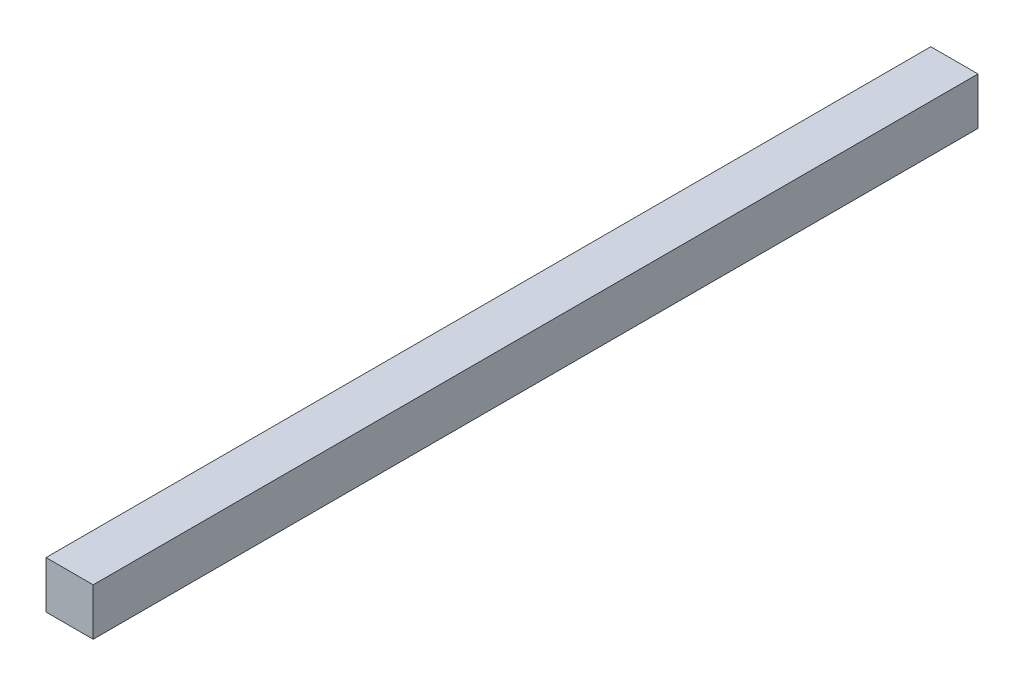
ISO-10303-21;
HEADER;
FILE_DESCRIPTION(('STEP AP214'),'2;1');
FILE_NAME('part.step','',(''),(''),'','','');
FILE_SCHEMA(('AUTOMOTIVE_DESIGN { 1 0 10303 214 1 1 1 1 }'));
ENDSEC;
DATA;
#1=APPLICATION_CONTEXT('core data for automotive mechanical design processes');
#2=APPLICATION_PROTOCOL_DEFINITION('international standard','automotive_design',2000,#1);
#3=PRODUCT_CONTEXT('',#1,'mechanical');
#4=PRODUCT('Part','Part','',(#3));
#5=PRODUCT_RELATED_PRODUCT_CATEGORY('part','',(#4));
#6=PRODUCT_DEFINITION_FORMATION('','',#4);
#7=PRODUCT_DEFINITION_CONTEXT('part definition',#1,'design');
#8=PRODUCT_DEFINITION('design','',#6,#7);
#9=PRODUCT_DEFINITION_SHAPE('','',#8);
#10=(LENGTH_UNIT() NAMED_UNIT(*) SI_UNIT(.MILLI.,.METRE.));
#11=(NAMED_UNIT(*) PLANE_ANGLE_UNIT() SI_UNIT($,.RADIAN.));
#12=(NAMED_UNIT(*) SI_UNIT($,.STERADIAN.) SOLID_ANGLE_UNIT());
#13=UNCERTAINTY_MEASURE_WITH_UNIT(LENGTH_MEASURE(1.E-05),#10,'distance_accuracy_value','');
#14=(GEOMETRIC_REPRESENTATION_CONTEXT(3) GLOBAL_UNCERTAINTY_ASSIGNED_CONTEXT((#13)) GLOBAL_UNIT_ASSIGNED_CONTEXT((#10,
#11,#12)) REPRESENTATION_CONTEXT('',''));
#15=CARTESIAN_POINT('',(0.,0.,0.));
#16=DIRECTION('',(0.,0.,1.));
#17=DIRECTION('',(1.,0.,0.));
#18=AXIS2_PLACEMENT_3D('',#15,#16,#17);
#19=CARTESIAN_POINT('',(0.,0.,300.));
#20=DIRECTION('',(1.,0.,0.));
#21=DIRECTION('',(0.,0.,-1.));
#22=AXIS2_PLACEMENT_3D('',#19,#20,#21);
#23=PLANE('',#22);
#24=DIRECTION('',(0.,-1.,0.));
#25=VECTOR('',#24,1.);
#26=CARTESIAN_POINT('',(0.,0.,0.));
#27=LINE('',#26,#25);
#28=CARTESIAN_POINT('',(0.,16.,0.));
#29=VERTEX_POINT('',#28);
#30=CARTESIAN_POINT('',(0.,0.,0.));
#31=VERTEX_POINT('',#30);
#32=EDGE_CURVE('E96',#29,#31,#27,.T.);
#33=ORIENTED_EDGE('',*,*,#32,.T.);
#34=DIRECTION('',(0.,0.,-1.));
#35=VECTOR('',#34,1.);
#36=CARTESIAN_POINT('',(0.,0.,300.));
#37=LINE('',#36,#35);
#38=CARTESIAN_POINT('',(0.,0.,300.));
#39=VERTEX_POINT('',#38);
#40=EDGE_CURVE('E11',#39,#31,#37,.T.);
#41=ORIENTED_EDGE('',*,*,#40,.F.);
#42=DIRECTION('',(0.,-1.,0.));
#43=VECTOR('',#42,1.);
#44=CARTESIAN_POINT('',(0.,0.,300.));
#45=LINE('',#44,#43);
#46=CARTESIAN_POINT('',(0.,16.,300.));
#47=VERTEX_POINT('',#46);
#48=EDGE_CURVE('E84',#47,#39,#45,.T.);
#49=ORIENTED_EDGE('',*,*,#48,.F.);
#50=DIRECTION('',(0.,0.,-1.));
#51=VECTOR('',#50,1.);
#52=CARTESIAN_POINT('',(0.,16.,300.));
#53=LINE('',#52,#51);
#54=EDGE_CURVE('E92',#47,#29,#53,.T.);
#55=ORIENTED_EDGE('',*,*,#54,.T.);
#56=EDGE_LOOP('',(#33,#41,#49,#55));
#57=FACE_BOUND('',#56,.T.);
#58=ADVANCED_FACE('F33',(#57),#23,.F.);
#59=CARTESIAN_POINT('',(0.,0.,300.));
#60=DIRECTION('',(0.,1.,0.));
#61=DIRECTION('',(0.,0.,1.));
#62=AXIS2_PLACEMENT_3D('',#59,#60,#61);
#63=PLANE('',#62);
#64=DIRECTION('',(1.,0.,0.));
#65=VECTOR('',#64,1.);
#66=CARTESIAN_POINT('',(0.,0.,0.));
#67=LINE('',#66,#65);
#68=CARTESIAN_POINT('',(16.,0.,0.));
#69=VERTEX_POINT('',#68);
#70=EDGE_CURVE('E88',#31,#69,#67,.T.);
#71=ORIENTED_EDGE('',*,*,#70,.T.);
#72=DIRECTION('',(0.,0.,-1.));
#73=VECTOR('',#72,1.);
#74=CARTESIAN_POINT('',(16.,0.,300.));
#75=LINE('',#74,#73);
#76=CARTESIAN_POINT('',(16.,0.,300.));
#77=VERTEX_POINT('',#76);
#78=EDGE_CURVE('E41',#77,#69,#75,.T.);
#79=ORIENTED_EDGE('',*,*,#78,.F.);
#80=DIRECTION('',(1.,0.,0.));
#81=VECTOR('',#80,1.);
#82=CARTESIAN_POINT('',(0.,0.,300.));
#83=LINE('',#82,#81);
#84=EDGE_CURVE('E79',#39,#77,#83,.T.);
#85=ORIENTED_EDGE('',*,*,#84,.F.);
#86=ORIENTED_EDGE('',*,*,#40,.T.);
#87=EDGE_LOOP('',(#71,#79,#85,#86));
#88=FACE_BOUND('',#87,.T.);
#89=ADVANCED_FACE('F87',(#88),#63,.F.);
#90=CARTESIAN_POINT('',(16.,0.,300.));
#91=DIRECTION('',(-1.,0.,0.));
#92=DIRECTION('',(0.,0.,1.));
#93=AXIS2_PLACEMENT_3D('',#90,#91,#92);
#94=PLANE('',#93);
#95=DIRECTION('',(0.,1.,0.));
#96=VECTOR('',#95,1.);
#97=CARTESIAN_POINT('',(16.,0.,0.));
#98=LINE('',#97,#96);
#99=CARTESIAN_POINT('',(16.,16.,0.));
#100=VERTEX_POINT('',#99);
#101=EDGE_CURVE('E66',#69,#100,#98,.T.);
#102=ORIENTED_EDGE('',*,*,#101,.T.);
#103=DIRECTION('',(0.,0.,-1.));
#104=VECTOR('',#103,1.);
#105=CARTESIAN_POINT('',(16.,16.,300.));
#106=LINE('',#105,#104);
#107=CARTESIAN_POINT('',(16.,16.,300.));
#108=VERTEX_POINT('',#107);
#109=EDGE_CURVE('E89',#108,#100,#106,.T.);
#110=ORIENTED_EDGE('',*,*,#109,.F.);
#111=DIRECTION('',(0.,1.,0.));
#112=VECTOR('',#111,1.);
#113=CARTESIAN_POINT('',(16.,0.,300.));
#114=LINE('',#113,#112);
#115=EDGE_CURVE('E82',#77,#108,#114,.T.);
#116=ORIENTED_EDGE('',*,*,#115,.F.);
#117=ORIENTED_EDGE('',*,*,#78,.T.);
#118=EDGE_LOOP('',(#102,#110,#116,#117));
#119=FACE_BOUND('',#118,.T.);
#120=ADVANCED_FACE('F90',(#119),#94,.F.);
#121=CARTESIAN_POINT('',(0.,16.,300.));
#122=DIRECTION('',(0.,-1.,0.));
#123=DIRECTION('',(0.,0.,-1.));
#124=AXIS2_PLACEMENT_3D('',#121,#122,#123);
#125=PLANE('',#124);
#126=DIRECTION('',(-1.,0.,0.));
#127=VECTOR('',#126,1.);
#128=CARTESIAN_POINT('',(0.,16.,0.));
#129=LINE('',#128,#127);
#130=EDGE_CURVE('E72',#100,#29,#129,.T.);
#131=ORIENTED_EDGE('',*,*,#130,.T.);
#132=ORIENTED_EDGE('',*,*,#54,.F.);
#133=DIRECTION('',(-1.,0.,0.));
#134=VECTOR('',#133,1.);
#135=CARTESIAN_POINT('',(0.,16.,300.));
#136=LINE('',#135,#134);
#137=EDGE_CURVE('E49',#108,#47,#136,.T.);
#138=ORIENTED_EDGE('',*,*,#137,.F.);
#139=ORIENTED_EDGE('',*,*,#109,.T.);
#140=EDGE_LOOP('',(#131,#132,#138,#139));
#141=FACE_BOUND('',#140,.T.);
#142=ADVANCED_FACE('F103',(#141),#125,.F.);
#143=CARTESIAN_POINT('',(0.,0.,300.));
#144=DIRECTION('',(0.,0.,-1.));
#145=DIRECTION('',(-1.,0.,0.));
#146=AXIS2_PLACEMENT_3D('',#143,#144,#145);
#147=PLANE('',#146);
#148=ORIENTED_EDGE('',*,*,#48,.T.);
#149=ORIENTED_EDGE('',*,*,#84,.T.);
#150=ORIENTED_EDGE('',*,*,#115,.T.);
#151=ORIENTED_EDGE('',*,*,#137,.T.);
#152=EDGE_LOOP('',(#148,#149,#150,#151));
#153=FACE_BOUND('',#152,.T.);
#154=ADVANCED_FACE('F80',(#153),#147,.F.);
#155=CARTESIAN_POINT('',(0.,0.,0.));
#156=DIRECTION('',(0.,0.,-1.));
#157=DIRECTION('',(-1.,0.,0.));
#158=AXIS2_PLACEMENT_3D('',#155,#156,#157);
#159=PLANE('',#158);
#160=ORIENTED_EDGE('',*,*,#32,.F.);
#161=ORIENTED_EDGE('',*,*,#130,.F.);
#162=ORIENTED_EDGE('',*,*,#101,.F.);
#163=ORIENTED_EDGE('',*,*,#70,.F.);
#164=EDGE_LOOP('',(#160,#161,#162,#163));
#165=FACE_BOUND('',#164,.T.);
#166=ADVANCED_FACE('F106',(#165),#159,.T.);
#167=CLOSED_SHELL('',(#58,#89,#120,#142,#154,#166));
#168=MANIFOLD_SOLID_BREP('B2',#167);
#169=ADVANCED_BREP_SHAPE_REPRESENTATION('',(#18,#168),#14);
#170=SHAPE_DEFINITION_REPRESENTATION(#9,#169);
ENDSEC;
END-ISO-10303-21;
